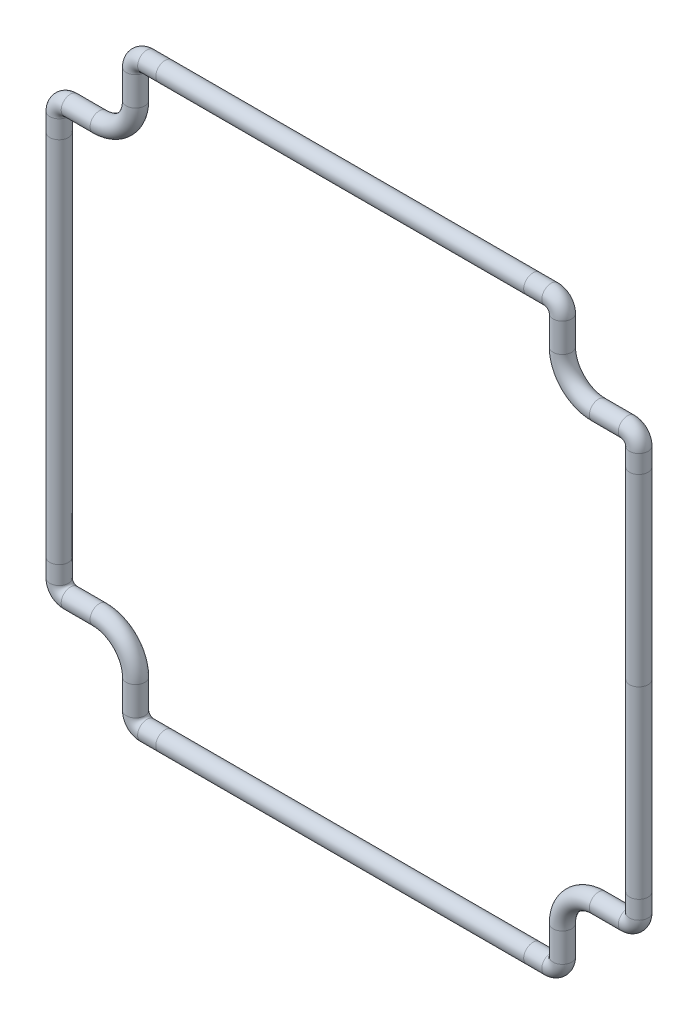
ISO-10303-21;
HEADER;
FILE_DESCRIPTION(('STEP AP214'),'2;1');
FILE_NAME('part.step','',(''),(''),'','','');
FILE_SCHEMA(('AUTOMOTIVE_DESIGN { 1 0 10303 214 1 1 1 1 }'));
ENDSEC;
DATA;
#1=APPLICATION_CONTEXT('core data for automotive mechanical design processes');
#2=APPLICATION_PROTOCOL_DEFINITION('international standard','automotive_design',2000,#1);
#3=PRODUCT_CONTEXT('',#1,'mechanical');
#4=PRODUCT('Part','Part','',(#3));
#5=PRODUCT_RELATED_PRODUCT_CATEGORY('part','',(#4));
#6=PRODUCT_DEFINITION_FORMATION('','',#4);
#7=PRODUCT_DEFINITION_CONTEXT('part definition',#1,'design');
#8=PRODUCT_DEFINITION('design','',#6,#7);
#9=PRODUCT_DEFINITION_SHAPE('','',#8);
#10=(LENGTH_UNIT() NAMED_UNIT(*) SI_UNIT(.MILLI.,.METRE.));
#11=(NAMED_UNIT(*) PLANE_ANGLE_UNIT() SI_UNIT($,.RADIAN.));
#12=(NAMED_UNIT(*) SI_UNIT($,.STERADIAN.) SOLID_ANGLE_UNIT());
#13=UNCERTAINTY_MEASURE_WITH_UNIT(LENGTH_MEASURE(1.E-05),#10,'distance_accuracy_value','');
#14=(GEOMETRIC_REPRESENTATION_CONTEXT(3) GLOBAL_UNCERTAINTY_ASSIGNED_CONTEXT((#13)) GLOBAL_UNIT_ASSIGNED_CONTEXT((#10,
#11,#12)) REPRESENTATION_CONTEXT('',''));
#15=CARTESIAN_POINT('',(0.,0.,0.));
#16=DIRECTION('',(0.,0.,1.));
#17=DIRECTION('',(1.,0.,0.));
#18=AXIS2_PLACEMENT_3D('',#15,#16,#17);
#19=CARTESIAN_POINT('',(20.32,0.,0.));
#20=DIRECTION('',(0.,-1.,0.));
#21=DIRECTION('',(0.,0.,-1.));
#22=AXIS2_PLACEMENT_3D('',#19,#20,#21);
#23=CYLINDRICAL_SURFACE('',#22,0.650000000000001);
#24=CARTESIAN_POINT('',(20.32,-12.8968500000001,0.));
#25=DIRECTION('',(0.,1.,0.));
#26=DIRECTION('',(0.,0.,1.));
#27=AXIS2_PLACEMENT_3D('',#24,#25,#26);
#28=CIRCLE('',#27,0.650000000000001);
#29=CARTESIAN_POINT('',(20.32,-12.8968500000001,0.650000000000001));
#30=VERTEX_POINT('',#29);
#31=EDGE_CURVE('E133',#30,#30,#28,.T.);
#32=ORIENTED_EDGE('',*,*,#31,.T.);
#33=EDGE_LOOP('',(#32));
#34=FACE_BOUND('',#33,.T.);
#35=CARTESIAN_POINT('',(20.32,0.,0.));
#36=DIRECTION('',(0.,1.,0.));
#37=DIRECTION('',(0.,0.,1.));
#38=AXIS2_PLACEMENT_3D('',#35,#36,#37);
#39=CIRCLE('',#38,0.650000000000001);
#40=CARTESIAN_POINT('',(20.32,0.,0.650000000000001));
#41=VERTEX_POINT('',#40);
#42=EDGE_CURVE('E136',#41,#41,#39,.T.);
#43=ORIENTED_EDGE('',*,*,#42,.F.);
#44=EDGE_LOOP('',(#43));
#45=FACE_BOUND('',#44,.T.);
#46=ADVANCED_FACE('F32',(#34,#45),#23,.T.);
#47=CARTESIAN_POINT('',(20.32,-12.896849999997,0.));
#48=DIRECTION('',(-1.52983487645165E-13,-1.,0.));
#49=DIRECTION('',(1.,-1.52983487645165E-13,0.));
#50=AXIS2_PLACEMENT_3D('',#47,#48,#49);
#51=CYLINDRICAL_SURFACE('',#50,0.650000000000001);
#52=CARTESIAN_POINT('',(20.3199999999998,-14.1668499999973,0.));
#53=DIRECTION('',(0.,1.,0.));
#54=DIRECTION('',(0.,0.,1.));
#55=AXIS2_PLACEMENT_3D('',#52,#53,#54);
#56=CIRCLE('',#55,0.650000000000001);
#57=CARTESIAN_POINT('',(20.9699999999998,-14.1668499999948,0.));
#58=VERTEX_POINT('',#57);
#59=EDGE_CURVE('E130',#58,#58,#56,.T.);
#60=ORIENTED_EDGE('',*,*,#59,.T.);
#61=EDGE_LOOP('',(#60));
#62=FACE_BOUND('',#61,.T.);
#63=ORIENTED_EDGE('',*,*,#31,.F.);
#64=EDGE_LOOP('',(#63));
#65=FACE_BOUND('',#64,.T.);
#66=ADVANCED_FACE('F143',(#62,#65),#51,.T.);
#67=CARTESIAN_POINT('',(19.5262499999998,-14.1668500000004,0.));
#68=DIRECTION('',(0.,0.,-1.));
#69=DIRECTION('',(-1.,0.,0.));
#70=AXIS2_PLACEMENT_3D('',#67,#68,#69);
#71=TOROIDAL_SURFACE('',#70,0.793749999999999,0.650000000000001);
#72=CARTESIAN_POINT('',(19.5262499999998,-14.9606000000004,0.));
#73=DIRECTION('',(1.,0.,0.));
#74=DIRECTION('',(0.,0.,1.));
#75=AXIS2_PLACEMENT_3D('',#72,#73,#74);
#76=CIRCLE('',#75,0.650000000000001);
#77=CARTESIAN_POINT('',(19.5262499999998,-15.6106000000004,0.));
#78=VERTEX_POINT('',#77);
#79=EDGE_CURVE('E127',#78,#78,#76,.T.);
#80=CARTESIAN_POINT('',(19.5262499999998,-14.1668500000004,0.));
#81=DIRECTION('',(0.,0.,-1.));
#82=DIRECTION('',(-1.,0.,0.));
#83=AXIS2_PLACEMENT_3D('',#80,#81,#82);
#84=CIRCLE('',#83,1.44375);
#85=EDGE_CURVE('',#58,#78,#84,.T.);
#86=ORIENTED_EDGE('',*,*,#59,.F.);
#87=ORIENTED_EDGE('',*,*,#79,.T.);
#88=ORIENTED_EDGE('',*,*,#85,.T.);
#89=ORIENTED_EDGE('',*,*,#85,.F.);
#90=EDGE_LOOP('',(#86,#88,#87,#89));
#91=FACE_BOUND('',#90,.T.);
#92=ADVANCED_FACE('F149',(#91),#71,.T.);
#93=CARTESIAN_POINT('',(19.5262499999998,-14.9606000000004,0.));
#94=DIRECTION('',(-1.,0.,0.));
#95=DIRECTION('',(0.,-1.,0.));
#96=AXIS2_PLACEMENT_3D('',#93,#94,#95);
#97=CYLINDRICAL_SURFACE('',#96,0.650000000000001);
#98=CARTESIAN_POINT('',(17.5005999999996,-14.9606000000004,0.));
#99=DIRECTION('',(1.,0.,0.));
#100=DIRECTION('',(0.,0.,1.));
#101=AXIS2_PLACEMENT_3D('',#98,#99,#100);
#102=CIRCLE('',#101,0.650000000000001);
#103=CARTESIAN_POINT('',(17.5005999999996,-14.3106000000004,0.));
#104=VERTEX_POINT('',#103);
#105=EDGE_CURVE('E124',#104,#104,#102,.T.);
#106=ORIENTED_EDGE('',*,*,#105,.T.);
#107=EDGE_LOOP('',(#106));
#108=FACE_BOUND('',#107,.T.);
#109=ORIENTED_EDGE('',*,*,#79,.F.);
#110=EDGE_LOOP('',(#109));
#111=FACE_BOUND('',#110,.T.);
#112=ADVANCED_FACE('F155',(#108,#111),#97,.T.);
#113=CARTESIAN_POINT('',(17.5005999999996,-17.5006000000004,0.));
#114=DIRECTION('',(0.,0.,1.));
#115=DIRECTION('',(1.,0.,0.));
#116=AXIS2_PLACEMENT_3D('',#113,#114,#115);
#117=TOROIDAL_SURFACE('',#116,2.54,0.650000000000001);
#118=CARTESIAN_POINT('',(14.9605999999996,-17.5006000000003,0.));
#119=DIRECTION('',(0.,1.,0.));
#120=DIRECTION('',(0.,0.,1.));
#121=AXIS2_PLACEMENT_3D('',#118,#119,#120);
#122=CIRCLE('',#121,0.650000000000001);
#123=CARTESIAN_POINT('',(14.3105999999996,-17.5006000000003,0.));
#124=VERTEX_POINT('',#123);
#125=EDGE_CURVE('E121',#124,#124,#122,.T.);
#126=CARTESIAN_POINT('',(17.5005999999996,-17.5006000000004,0.));
#127=DIRECTION('',(0.,0.,1.));
#128=DIRECTION('',(1.,0.,0.));
#129=AXIS2_PLACEMENT_3D('',#126,#127,#128);
#130=CIRCLE('',#129,3.19);
#131=EDGE_CURVE('',#104,#124,#130,.T.);
#132=ORIENTED_EDGE('',*,*,#105,.F.);
#133=ORIENTED_EDGE('',*,*,#125,.T.);
#134=ORIENTED_EDGE('',*,*,#131,.T.);
#135=ORIENTED_EDGE('',*,*,#131,.F.);
#136=EDGE_LOOP('',(#132,#134,#133,#135));
#137=FACE_BOUND('',#136,.T.);
#138=ADVANCED_FACE('F159',(#137),#117,.T.);
#139=CARTESIAN_POINT('',(14.9605999999996,-17.5006000000002,0.));
#140=DIRECTION('',(0.,-1.,0.));
#141=DIRECTION('',(1.,0.,0.));
#142=AXIS2_PLACEMENT_3D('',#139,#140,#141);
#143=CYLINDRICAL_SURFACE('',#142,0.650000000000001);
#144=CARTESIAN_POINT('',(14.9605999999996,-19.5262499999999,0.));
#145=DIRECTION('',(0.,1.,0.));
#146=DIRECTION('',(0.,0.,1.));
#147=AXIS2_PLACEMENT_3D('',#144,#145,#146);
#148=CIRCLE('',#147,0.650000000000001);
#149=CARTESIAN_POINT('',(15.6105999999996,-19.5262499999997,0.));
#150=VERTEX_POINT('',#149);
#151=EDGE_CURVE('E118',#150,#150,#148,.T.);
#152=ORIENTED_EDGE('',*,*,#151,.T.);
#153=EDGE_LOOP('',(#152));
#154=FACE_BOUND('',#153,.T.);
#155=ORIENTED_EDGE('',*,*,#125,.F.);
#156=EDGE_LOOP('',(#155));
#157=FACE_BOUND('',#156,.T.);
#158=ADVANCED_FACE('F163',(#154,#157),#143,.T.);
#159=CARTESIAN_POINT('',(14.1668499999996,-19.5262500000001,0.));
#160=DIRECTION('',(0.,0.,-1.));
#161=DIRECTION('',(-1.,0.,0.));
#162=AXIS2_PLACEMENT_3D('',#159,#160,#161);
#163=TOROIDAL_SURFACE('',#162,0.793749999999999,0.650000000000001);
#164=CARTESIAN_POINT('',(14.1668499999995,-20.3200000000001,0.));
#165=DIRECTION('',(1.,0.,0.));
#166=DIRECTION('',(0.,0.,1.));
#167=AXIS2_PLACEMENT_3D('',#164,#165,#166);
#168=CIRCLE('',#167,0.650000000000001);
#169=CARTESIAN_POINT('',(14.1668499999995,-20.9700000000001,0.));
#170=VERTEX_POINT('',#169);
#171=EDGE_CURVE('E115',#170,#170,#168,.T.);
#172=CARTESIAN_POINT('',(14.1668499999996,-19.5262500000001,0.));
#173=DIRECTION('',(0.,0.,-1.));
#174=DIRECTION('',(-1.,0.,0.));
#175=AXIS2_PLACEMENT_3D('',#172,#173,#174);
#176=CIRCLE('',#175,1.44375);
#177=EDGE_CURVE('',#150,#170,#176,.T.);
#178=ORIENTED_EDGE('',*,*,#151,.F.);
#179=ORIENTED_EDGE('',*,*,#171,.T.);
#180=ORIENTED_EDGE('',*,*,#177,.T.);
#181=ORIENTED_EDGE('',*,*,#177,.F.);
#182=EDGE_LOOP('',(#178,#180,#179,#181));
#183=FACE_BOUND('',#182,.T.);
#184=ADVANCED_FACE('F167',(#183),#163,.T.);
#185=CARTESIAN_POINT('',(14.1668499999995,-20.3200000000001,0.));
#186=DIRECTION('',(-1.,0.,0.));
#187=DIRECTION('',(0.,-1.,0.));
#188=AXIS2_PLACEMENT_3D('',#185,#186,#187);
#189=CYLINDRICAL_SURFACE('',#188,0.650000000000001);
#190=CARTESIAN_POINT('',(12.8968499999998,-20.32,0.));
#191=DIRECTION('',(1.,0.,0.));
#192=DIRECTION('',(0.,0.,1.));
#193=AXIS2_PLACEMENT_3D('',#190,#191,#192);
#194=CIRCLE('',#193,0.650000000000001);
#195=CARTESIAN_POINT('',(12.8968499999998,-20.32,0.650000000000001));
#196=VERTEX_POINT('',#195);
#197=EDGE_CURVE('E112',#196,#196,#194,.T.);
#198=ORIENTED_EDGE('',*,*,#197,.T.);
#199=EDGE_LOOP('',(#198));
#200=FACE_BOUND('',#199,.T.);
#201=ORIENTED_EDGE('',*,*,#171,.F.);
#202=EDGE_LOOP('',(#201));
#203=FACE_BOUND('',#202,.T.);
#204=ADVANCED_FACE('F171',(#200,#203),#189,.T.);
#205=CARTESIAN_POINT('',(12.8968499999998,-20.32,0.));
#206=DIRECTION('',(-1.,0.,0.));
#207=DIRECTION('',(0.,0.,1.));
#208=AXIS2_PLACEMENT_3D('',#205,#206,#207);
#209=CYLINDRICAL_SURFACE('',#208,0.650000000000001);
#210=CARTESIAN_POINT('',(-12.8968500000002,-20.32,0.));
#211=DIRECTION('',(1.,0.,0.));
#212=DIRECTION('',(0.,0.,1.));
#213=AXIS2_PLACEMENT_3D('',#210,#211,#212);
#214=CIRCLE('',#213,0.650000000000001);
#215=CARTESIAN_POINT('',(-12.8968500000002,-20.32,0.650000000000001));
#216=VERTEX_POINT('',#215);
#217=EDGE_CURVE('E109',#216,#216,#214,.T.);
#218=ORIENTED_EDGE('',*,*,#217,.T.);
#219=EDGE_LOOP('',(#218));
#220=FACE_BOUND('',#219,.T.);
#221=ORIENTED_EDGE('',*,*,#197,.F.);
#222=EDGE_LOOP('',(#221));
#223=FACE_BOUND('',#222,.T.);
#224=ADVANCED_FACE('F175',(#220,#223),#209,.T.);
#225=CARTESIAN_POINT('',(-12.8968500000002,-20.32,0.));
#226=DIRECTION('',(-1.,0.,0.));
#227=DIRECTION('',(0.,0.,1.));
#228=AXIS2_PLACEMENT_3D('',#225,#226,#227);
#229=CYLINDRICAL_SURFACE('',#228,0.650000000000001);
#230=CARTESIAN_POINT('',(-14.1668500000002,-20.32,0.));
#231=DIRECTION('',(1.,0.,0.));
#232=DIRECTION('',(0.,0.,1.));
#233=AXIS2_PLACEMENT_3D('',#230,#231,#232);
#234=CIRCLE('',#233,0.650000000000001);
#235=CARTESIAN_POINT('',(-14.1668500000002,-20.97,0.));
#236=VERTEX_POINT('',#235);
#237=EDGE_CURVE('E106',#236,#236,#234,.T.);
#238=ORIENTED_EDGE('',*,*,#237,.T.);
#239=EDGE_LOOP('',(#238));
#240=FACE_BOUND('',#239,.T.);
#241=ORIENTED_EDGE('',*,*,#217,.F.);
#242=EDGE_LOOP('',(#241));
#243=FACE_BOUND('',#242,.T.);
#244=ADVANCED_FACE('F179',(#240,#243),#229,.T.);
#245=CARTESIAN_POINT('',(-14.1668500000002,-19.52625,0.));
#246=DIRECTION('',(0.,0.,-1.));
#247=DIRECTION('',(-1.,0.,0.));
#248=AXIS2_PLACEMENT_3D('',#245,#246,#247);
#249=TOROIDAL_SURFACE('',#248,0.793749999999999,0.650000000000001);
#250=CARTESIAN_POINT('',(-14.9606000000002,-19.52625,0.));
#251=DIRECTION('',(0.,-1.,0.));
#252=DIRECTION('',(0.,0.,1.));
#253=AXIS2_PLACEMENT_3D('',#250,#251,#252);
#254=CIRCLE('',#253,0.650000000000001);
#255=CARTESIAN_POINT('',(-15.6106000000002,-19.52625,0.));
#256=VERTEX_POINT('',#255);
#257=EDGE_CURVE('E103',#256,#256,#254,.T.);
#258=CARTESIAN_POINT('',(-14.1668500000002,-19.52625,0.));
#259=DIRECTION('',(0.,0.,-1.));
#260=DIRECTION('',(-1.,0.,0.));
#261=AXIS2_PLACEMENT_3D('',#258,#259,#260);
#262=CIRCLE('',#261,1.44375);
#263=EDGE_CURVE('',#236,#256,#262,.T.);
#264=ORIENTED_EDGE('',*,*,#237,.F.);
#265=ORIENTED_EDGE('',*,*,#257,.T.);
#266=ORIENTED_EDGE('',*,*,#263,.T.);
#267=ORIENTED_EDGE('',*,*,#263,.F.);
#268=EDGE_LOOP('',(#264,#266,#265,#267));
#269=FACE_BOUND('',#268,.T.);
#270=ADVANCED_FACE('F183',(#269),#249,.T.);
#271=CARTESIAN_POINT('',(-14.9606000000002,-19.52625,0.));
#272=DIRECTION('',(0.,1.,0.));
#273=DIRECTION('',(-1.,0.,0.));
#274=AXIS2_PLACEMENT_3D('',#271,#272,#273);
#275=CYLINDRICAL_SURFACE('',#274,0.650000000000001);
#276=CARTESIAN_POINT('',(-14.9606000000002,-17.5005999999998,0.));
#277=DIRECTION('',(0.,-1.,0.));
#278=DIRECTION('',(0.,0.,1.));
#279=AXIS2_PLACEMENT_3D('',#276,#277,#278);
#280=CIRCLE('',#279,0.650000000000001);
#281=CARTESIAN_POINT('',(-14.3106000000002,-17.5005999999998,0.));
#282=VERTEX_POINT('',#281);
#283=EDGE_CURVE('E100',#282,#282,#280,.T.);
#284=ORIENTED_EDGE('',*,*,#283,.T.);
#285=EDGE_LOOP('',(#284));
#286=FACE_BOUND('',#285,.T.);
#287=ORIENTED_EDGE('',*,*,#257,.F.);
#288=EDGE_LOOP('',(#287));
#289=FACE_BOUND('',#288,.T.);
#290=ADVANCED_FACE('F187',(#286,#289),#275,.T.);
#291=CARTESIAN_POINT('',(-17.5006000000002,-17.5005999999998,0.));
#292=DIRECTION('',(0.,0.,1.));
#293=DIRECTION('',(1.,0.,0.));
#294=AXIS2_PLACEMENT_3D('',#291,#292,#293);
#295=TOROIDAL_SURFACE('',#294,2.54,0.650000000000001);
#296=CARTESIAN_POINT('',(-17.5006000000002,-14.9605999999998,0.));
#297=DIRECTION('',(1.,0.,0.));
#298=DIRECTION('',(0.,0.,1.));
#299=AXIS2_PLACEMENT_3D('',#296,#297,#298);
#300=CIRCLE('',#299,0.650000000000001);
#301=CARTESIAN_POINT('',(-17.5006000000002,-14.3105999999998,0.));
#302=VERTEX_POINT('',#301);
#303=EDGE_CURVE('E97',#302,#302,#300,.T.);
#304=CARTESIAN_POINT('',(-17.5006000000002,-17.5005999999998,0.));
#305=DIRECTION('',(0.,0.,1.));
#306=DIRECTION('',(1.,0.,0.));
#307=AXIS2_PLACEMENT_3D('',#304,#305,#306);
#308=CIRCLE('',#307,3.19);
#309=EDGE_CURVE('',#282,#302,#308,.T.);
#310=ORIENTED_EDGE('',*,*,#283,.F.);
#311=ORIENTED_EDGE('',*,*,#303,.T.);
#312=ORIENTED_EDGE('',*,*,#309,.T.);
#313=ORIENTED_EDGE('',*,*,#309,.F.);
#314=EDGE_LOOP('',(#310,#312,#311,#313));
#315=FACE_BOUND('',#314,.T.);
#316=ADVANCED_FACE('F191',(#315),#295,.T.);
#317=CARTESIAN_POINT('',(-17.5006000000002,-14.9605999999998,0.));
#318=DIRECTION('',(-1.,0.,0.));
#319=DIRECTION('',(0.,0.,1.));
#320=AXIS2_PLACEMENT_3D('',#317,#318,#319);
#321=CYLINDRICAL_SURFACE('',#320,0.650000000000001);
#322=CARTESIAN_POINT('',(-19.5262499999999,-14.9605999999998,0.));
#323=DIRECTION('',(1.,0.,0.));
#324=DIRECTION('',(0.,0.,1.));
#325=AXIS2_PLACEMENT_3D('',#322,#323,#324);
#326=CIRCLE('',#325,0.650000000000001);
#327=CARTESIAN_POINT('',(-19.5262499999999,-15.6105999999998,0.));
#328=VERTEX_POINT('',#327);
#329=EDGE_CURVE('E94',#328,#328,#326,.T.);
#330=ORIENTED_EDGE('',*,*,#329,.T.);
#331=EDGE_LOOP('',(#330));
#332=FACE_BOUND('',#331,.T.);
#333=ORIENTED_EDGE('',*,*,#303,.F.);
#334=EDGE_LOOP('',(#333));
#335=FACE_BOUND('',#334,.T.);
#336=ADVANCED_FACE('F195',(#332,#335),#321,.T.);
#337=CARTESIAN_POINT('',(-19.5262499999999,-14.1668499999998,0.));
#338=DIRECTION('',(0.,0.,-1.));
#339=DIRECTION('',(-1.,0.,0.));
#340=AXIS2_PLACEMENT_3D('',#337,#338,#339);
#341=TOROIDAL_SURFACE('',#340,0.793749999999999,0.650000000000001);
#342=CARTESIAN_POINT('',(-20.3199999999999,-14.1668499999998,0.));
#343=DIRECTION('',(0.,-1.,0.));
#344=DIRECTION('',(0.,0.,1.));
#345=AXIS2_PLACEMENT_3D('',#342,#343,#344);
#346=CIRCLE('',#345,0.650000000000001);
#347=CARTESIAN_POINT('',(-20.9699999999999,-14.1668499999997,0.));
#348=VERTEX_POINT('',#347);
#349=EDGE_CURVE('E91',#348,#348,#346,.T.);
#350=CARTESIAN_POINT('',(-19.5262499999999,-14.1668499999998,0.));
#351=DIRECTION('',(0.,0.,-1.));
#352=DIRECTION('',(-1.,0.,0.));
#353=AXIS2_PLACEMENT_3D('',#350,#351,#352);
#354=CIRCLE('',#353,1.44375);
#355=EDGE_CURVE('',#328,#348,#354,.T.);
#356=ORIENTED_EDGE('',*,*,#329,.F.);
#357=ORIENTED_EDGE('',*,*,#349,.T.);
#358=ORIENTED_EDGE('',*,*,#355,.T.);
#359=ORIENTED_EDGE('',*,*,#355,.F.);
#360=EDGE_LOOP('',(#356,#358,#357,#359));
#361=FACE_BOUND('',#360,.T.);
#362=ADVANCED_FACE('F199',(#361),#341,.T.);
#363=CARTESIAN_POINT('',(-20.3199999999999,-14.1668499999998,0.));
#364=DIRECTION('',(0.,1.,0.));
#365=DIRECTION('',(0.,0.,1.));
#366=AXIS2_PLACEMENT_3D('',#363,#364,#365);
#367=CYLINDRICAL_SURFACE('',#366,0.650000000000001);
#368=CARTESIAN_POINT('',(-20.3199999999999,-12.8968499999997,0.));
#369=DIRECTION('',(0.,-1.,0.));
#370=DIRECTION('',(0.,0.,1.));
#371=AXIS2_PLACEMENT_3D('',#368,#369,#370);
#372=CIRCLE('',#371,0.650000000000001);
#373=CARTESIAN_POINT('',(-20.3199999999999,-12.8968499999997,0.650000000000001));
#374=VERTEX_POINT('',#373);
#375=EDGE_CURVE('E88',#374,#374,#372,.T.);
#376=ORIENTED_EDGE('',*,*,#375,.T.);
#377=EDGE_LOOP('',(#376));
#378=FACE_BOUND('',#377,.T.);
#379=ORIENTED_EDGE('',*,*,#349,.F.);
#380=EDGE_LOOP('',(#379));
#381=FACE_BOUND('',#380,.T.);
#382=ADVANCED_FACE('F203',(#378,#381),#367,.T.);
#383=CARTESIAN_POINT('',(-20.3199999999999,-12.8968499999997,0.));
#384=DIRECTION('',(0.,1.,0.));
#385=DIRECTION('',(-1.,0.,0.));
#386=AXIS2_PLACEMENT_3D('',#383,#384,#385);
#387=CYLINDRICAL_SURFACE('',#386,0.650000000000001);
#388=CARTESIAN_POINT('',(-20.3199999999999,12.8968500000003,0.));
#389=DIRECTION('',(0.,-1.,0.));
#390=DIRECTION('',(0.,0.,1.));
#391=AXIS2_PLACEMENT_3D('',#388,#389,#390);
#392=CIRCLE('',#391,0.650000000000001);
#393=CARTESIAN_POINT('',(-20.3199999999999,12.8968500000003,0.650000000000001));
#394=VERTEX_POINT('',#393);
#395=EDGE_CURVE('E85',#394,#394,#392,.T.);
#396=ORIENTED_EDGE('',*,*,#395,.T.);
#397=EDGE_LOOP('',(#396));
#398=FACE_BOUND('',#397,.T.);
#399=ORIENTED_EDGE('',*,*,#375,.F.);
#400=EDGE_LOOP('',(#399));
#401=FACE_BOUND('',#400,.T.);
#402=ADVANCED_FACE('F207',(#398,#401),#387,.T.);
#403=CARTESIAN_POINT('',(-20.3199999999999,12.8968500000003,0.));
#404=DIRECTION('',(0.,1.,0.));
#405=DIRECTION('',(0.,0.,1.));
#406=AXIS2_PLACEMENT_3D('',#403,#404,#405);
#407=CYLINDRICAL_SURFACE('',#406,0.650000000000001);
#408=CARTESIAN_POINT('',(-20.3199999999999,14.1668500000003,0.));
#409=DIRECTION('',(0.,-1.,0.));
#410=DIRECTION('',(0.,0.,1.));
#411=AXIS2_PLACEMENT_3D('',#408,#409,#410);
#412=CIRCLE('',#411,0.650000000000001);
#413=CARTESIAN_POINT('',(-20.9699999999999,14.1668500000003,0.));
#414=VERTEX_POINT('',#413);
#415=EDGE_CURVE('E82',#414,#414,#412,.T.);
#416=ORIENTED_EDGE('',*,*,#415,.T.);
#417=EDGE_LOOP('',(#416));
#418=FACE_BOUND('',#417,.T.);
#419=ORIENTED_EDGE('',*,*,#395,.F.);
#420=EDGE_LOOP('',(#419));
#421=FACE_BOUND('',#420,.T.);
#422=ADVANCED_FACE('F211',(#418,#421),#407,.T.);
#423=CARTESIAN_POINT('',(-19.5262499999999,14.1668500000003,0.));
#424=DIRECTION('',(0.,0.,-1.));
#425=DIRECTION('',(-1.,0.,0.));
#426=AXIS2_PLACEMENT_3D('',#423,#424,#425);
#427=TOROIDAL_SURFACE('',#426,0.793750000000003,0.650000000000001);
#428=CARTESIAN_POINT('',(-19.5262499999999,14.9606000000003,0.));
#429=DIRECTION('',(-1.,0.,0.));
#430=DIRECTION('',(0.,0.,1.));
#431=AXIS2_PLACEMENT_3D('',#428,#429,#430);
#432=CIRCLE('',#431,0.650000000000001);
#433=CARTESIAN_POINT('',(-19.5262499999999,15.6106000000003,0.));
#434=VERTEX_POINT('',#433);
#435=EDGE_CURVE('E79',#434,#434,#432,.T.);
#436=CARTESIAN_POINT('',(-19.5262499999999,14.1668500000003,0.));
#437=DIRECTION('',(0.,0.,-1.));
#438=DIRECTION('',(-1.,0.,0.));
#439=AXIS2_PLACEMENT_3D('',#436,#437,#438);
#440=CIRCLE('',#439,1.44375);
#441=EDGE_CURVE('',#414,#434,#440,.T.);
#442=ORIENTED_EDGE('',*,*,#415,.F.);
#443=ORIENTED_EDGE('',*,*,#435,.T.);
#444=ORIENTED_EDGE('',*,*,#441,.T.);
#445=ORIENTED_EDGE('',*,*,#441,.F.);
#446=EDGE_LOOP('',(#442,#444,#443,#445));
#447=FACE_BOUND('',#446,.T.);
#448=ADVANCED_FACE('F215',(#447),#427,.T.);
#449=CARTESIAN_POINT('',(-19.5262499999999,14.9606000000003,0.));
#450=DIRECTION('',(1.,0.,0.));
#451=DIRECTION('',(0.,1.,0.));
#452=AXIS2_PLACEMENT_3D('',#449,#450,#451);
#453=CYLINDRICAL_SURFACE('',#452,0.650000000000001);
#454=CARTESIAN_POINT('',(-17.5005999999997,14.9606000000003,0.));
#455=DIRECTION('',(-1.,0.,0.));
#456=DIRECTION('',(0.,0.,1.));
#457=AXIS2_PLACEMENT_3D('',#454,#455,#456);
#458=CIRCLE('',#457,0.650000000000001);
#459=CARTESIAN_POINT('',(-17.5005999999997,14.3106000000003,0.));
#460=VERTEX_POINT('',#459);
#461=EDGE_CURVE('E76',#460,#460,#458,.T.);
#462=ORIENTED_EDGE('',*,*,#461,.T.);
#463=EDGE_LOOP('',(#462));
#464=FACE_BOUND('',#463,.T.);
#465=ORIENTED_EDGE('',*,*,#435,.F.);
#466=EDGE_LOOP('',(#465));
#467=FACE_BOUND('',#466,.T.);
#468=ADVANCED_FACE('F219',(#464,#467),#453,.T.);
#469=CARTESIAN_POINT('',(-17.5005999999997,17.5006000000003,0.));
#470=DIRECTION('',(0.,0.,1.));
#471=DIRECTION('',(1.,0.,0.));
#472=AXIS2_PLACEMENT_3D('',#469,#470,#471);
#473=TOROIDAL_SURFACE('',#472,2.54,0.650000000000001);
#474=CARTESIAN_POINT('',(-14.9605999999997,17.5006000000003,0.));
#475=DIRECTION('',(0.,-1.,0.));
#476=DIRECTION('',(0.,0.,1.));
#477=AXIS2_PLACEMENT_3D('',#474,#475,#476);
#478=CIRCLE('',#477,0.650000000000001);
#479=CARTESIAN_POINT('',(-14.3105999999997,17.5006000000003,0.));
#480=VERTEX_POINT('',#479);
#481=EDGE_CURVE('E73',#480,#480,#478,.T.);
#482=CARTESIAN_POINT('',(-17.5005999999997,17.5006000000003,0.));
#483=DIRECTION('',(0.,0.,1.));
#484=DIRECTION('',(1.,0.,0.));
#485=AXIS2_PLACEMENT_3D('',#482,#483,#484);
#486=CIRCLE('',#485,3.19);
#487=EDGE_CURVE('',#460,#480,#486,.T.);
#488=ORIENTED_EDGE('',*,*,#461,.F.);
#489=ORIENTED_EDGE('',*,*,#481,.T.);
#490=ORIENTED_EDGE('',*,*,#487,.T.);
#491=ORIENTED_EDGE('',*,*,#487,.F.);
#492=EDGE_LOOP('',(#488,#490,#489,#491));
#493=FACE_BOUND('',#492,.T.);
#494=ADVANCED_FACE('F223',(#493),#473,.T.);
#495=CARTESIAN_POINT('',(-14.9605999999997,17.5006000000003,0.));
#496=DIRECTION('',(0.,1.,0.));
#497=DIRECTION('',(-1.,0.,0.));
#498=AXIS2_PLACEMENT_3D('',#495,#496,#497);
#499=CYLINDRICAL_SURFACE('',#498,0.650000000000001);
#500=CARTESIAN_POINT('',(-14.9605999999997,19.52625,0.));
#501=DIRECTION('',(0.,-1.,0.));
#502=DIRECTION('',(0.,0.,1.));
#503=AXIS2_PLACEMENT_3D('',#500,#501,#502);
#504=CIRCLE('',#503,0.650000000000001);
#505=CARTESIAN_POINT('',(-15.6105999999997,19.52625,0.));
#506=VERTEX_POINT('',#505);
#507=EDGE_CURVE('E70',#506,#506,#504,.T.);
#508=ORIENTED_EDGE('',*,*,#507,.T.);
#509=EDGE_LOOP('',(#508));
#510=FACE_BOUND('',#509,.T.);
#511=ORIENTED_EDGE('',*,*,#481,.F.);
#512=EDGE_LOOP('',(#511));
#513=FACE_BOUND('',#512,.T.);
#514=ADVANCED_FACE('F227',(#510,#513),#499,.T.);
#515=CARTESIAN_POINT('',(-14.1668499999997,19.52625,0.));
#516=DIRECTION('',(0.,0.,-1.));
#517=DIRECTION('',(-1.,0.,0.));
#518=AXIS2_PLACEMENT_3D('',#515,#516,#517);
#519=TOROIDAL_SURFACE('',#518,0.793749999999999,0.650000000000001);
#520=CARTESIAN_POINT('',(-14.1668499999997,20.32,0.));
#521=DIRECTION('',(-1.,0.,0.));
#522=DIRECTION('',(0.,0.,1.));
#523=AXIS2_PLACEMENT_3D('',#520,#521,#522);
#524=CIRCLE('',#523,0.650000000000001);
#525=CARTESIAN_POINT('',(-14.1668499999997,20.97,0.));
#526=VERTEX_POINT('',#525);
#527=EDGE_CURVE('E67',#526,#526,#524,.T.);
#528=CARTESIAN_POINT('',(-14.1668499999997,19.52625,0.));
#529=DIRECTION('',(0.,0.,-1.));
#530=DIRECTION('',(-1.,0.,0.));
#531=AXIS2_PLACEMENT_3D('',#528,#529,#530);
#532=CIRCLE('',#531,1.44375);
#533=EDGE_CURVE('',#506,#526,#532,.T.);
#534=ORIENTED_EDGE('',*,*,#507,.F.);
#535=ORIENTED_EDGE('',*,*,#527,.T.);
#536=ORIENTED_EDGE('',*,*,#533,.T.);
#537=ORIENTED_EDGE('',*,*,#533,.F.);
#538=EDGE_LOOP('',(#534,#536,#535,#537));
#539=FACE_BOUND('',#538,.T.);
#540=ADVANCED_FACE('F231',(#539),#519,.T.);
#541=CARTESIAN_POINT('',(-14.1668499999997,20.32,0.));
#542=DIRECTION('',(1.,0.,0.));
#543=DIRECTION('',(0.,1.,0.));
#544=AXIS2_PLACEMENT_3D('',#541,#542,#543);
#545=CYLINDRICAL_SURFACE('',#544,0.650000000000001);
#546=CARTESIAN_POINT('',(-12.8968499999997,20.3199999999999,0.));
#547=DIRECTION('',(-1.,0.,0.));
#548=DIRECTION('',(0.,0.,1.));
#549=AXIS2_PLACEMENT_3D('',#546,#547,#548);
#550=CIRCLE('',#549,0.650000000000001);
#551=CARTESIAN_POINT('',(-12.8968499999997,20.3199999999999,0.650000000000001));
#552=VERTEX_POINT('',#551);
#553=EDGE_CURVE('E64',#552,#552,#550,.T.);
#554=ORIENTED_EDGE('',*,*,#553,.T.);
#555=EDGE_LOOP('',(#554));
#556=FACE_BOUND('',#555,.T.);
#557=ORIENTED_EDGE('',*,*,#527,.F.);
#558=EDGE_LOOP('',(#557));
#559=FACE_BOUND('',#558,.T.);
#560=ADVANCED_FACE('F235',(#556,#559),#545,.T.);
#561=CARTESIAN_POINT('',(-12.8968499999997,20.3199999999999,0.));
#562=DIRECTION('',(1.,0.,0.));
#563=DIRECTION('',(0.,0.,-1.));
#564=AXIS2_PLACEMENT_3D('',#561,#562,#563);
#565=CYLINDRICAL_SURFACE('',#564,0.650000000000001);
#566=CARTESIAN_POINT('',(12.8968500000004,20.3199999999999,0.));
#567=DIRECTION('',(-1.,0.,0.));
#568=DIRECTION('',(0.,0.,1.));
#569=AXIS2_PLACEMENT_3D('',#566,#567,#568);
#570=CIRCLE('',#569,0.650000000000001);
#571=CARTESIAN_POINT('',(12.8968500000004,20.3199999999999,0.650000000000001));
#572=VERTEX_POINT('',#571);
#573=EDGE_CURVE('E61',#572,#572,#570,.T.);
#574=ORIENTED_EDGE('',*,*,#573,.T.);
#575=EDGE_LOOP('',(#574));
#576=FACE_BOUND('',#575,.T.);
#577=ORIENTED_EDGE('',*,*,#553,.F.);
#578=EDGE_LOOP('',(#577));
#579=FACE_BOUND('',#578,.T.);
#580=ADVANCED_FACE('F239',(#576,#579),#565,.T.);
#581=CARTESIAN_POINT('',(12.8968500000004,20.3199999999999,0.));
#582=DIRECTION('',(1.,0.,0.));
#583=DIRECTION('',(0.,1.,0.));
#584=AXIS2_PLACEMENT_3D('',#581,#582,#583);
#585=CYLINDRICAL_SURFACE('',#584,0.650000000000001);
#586=CARTESIAN_POINT('',(14.1668500000003,20.3199999999999,0.));
#587=DIRECTION('',(-1.,0.,0.));
#588=DIRECTION('',(0.,0.,1.));
#589=AXIS2_PLACEMENT_3D('',#586,#587,#588);
#590=CIRCLE('',#589,0.650000000000001);
#591=CARTESIAN_POINT('',(14.1668500000003,20.9699999999999,0.));
#592=VERTEX_POINT('',#591);
#593=EDGE_CURVE('E58',#592,#592,#590,.T.);
#594=ORIENTED_EDGE('',*,*,#593,.T.);
#595=EDGE_LOOP('',(#594));
#596=FACE_BOUND('',#595,.T.);
#597=ORIENTED_EDGE('',*,*,#573,.F.);
#598=EDGE_LOOP('',(#597));
#599=FACE_BOUND('',#598,.T.);
#600=ADVANCED_FACE('F243',(#596,#599),#585,.T.);
#601=CARTESIAN_POINT('',(14.1668500000003,19.5262499999999,0.));
#602=DIRECTION('',(0.,0.,-1.));
#603=DIRECTION('',(-1.,0.,0.));
#604=AXIS2_PLACEMENT_3D('',#601,#602,#603);
#605=TOROIDAL_SURFACE('',#604,0.793749999999999,0.650000000000001);
#606=CARTESIAN_POINT('',(14.9606000000003,19.5262499999999,0.));
#607=DIRECTION('',(0.,1.,0.));
#608=DIRECTION('',(0.,0.,1.));
#609=AXIS2_PLACEMENT_3D('',#606,#607,#608);
#610=CIRCLE('',#609,0.650000000000001);
#611=CARTESIAN_POINT('',(15.6106000000003,19.5262499999999,0.));
#612=VERTEX_POINT('',#611);
#613=EDGE_CURVE('E55',#612,#612,#610,.T.);
#614=CARTESIAN_POINT('',(14.1668500000003,19.5262499999999,0.));
#615=DIRECTION('',(0.,0.,-1.));
#616=DIRECTION('',(-1.,0.,0.));
#617=AXIS2_PLACEMENT_3D('',#614,#615,#616);
#618=CIRCLE('',#617,1.44375);
#619=EDGE_CURVE('',#592,#612,#618,.T.);
#620=ORIENTED_EDGE('',*,*,#593,.F.);
#621=ORIENTED_EDGE('',*,*,#613,.T.);
#622=ORIENTED_EDGE('',*,*,#619,.T.);
#623=ORIENTED_EDGE('',*,*,#619,.F.);
#624=EDGE_LOOP('',(#620,#622,#621,#623));
#625=FACE_BOUND('',#624,.T.);
#626=ADVANCED_FACE('F247',(#625),#605,.T.);
#627=CARTESIAN_POINT('',(14.9606000000003,19.52625,0.));
#628=DIRECTION('',(0.,-1.,0.));
#629=DIRECTION('',(1.,0.,0.));
#630=AXIS2_PLACEMENT_3D('',#627,#628,#629);
#631=CYLINDRICAL_SURFACE('',#630,0.650000000000001);
#632=CARTESIAN_POINT('',(14.9606000000003,17.5005999999998,0.));
#633=DIRECTION('',(0.,1.,0.));
#634=DIRECTION('',(0.,0.,1.));
#635=AXIS2_PLACEMENT_3D('',#632,#633,#634);
#636=CIRCLE('',#635,0.650000000000001);
#637=CARTESIAN_POINT('',(14.3106000000003,17.5005999999999,0.));
#638=VERTEX_POINT('',#637);
#639=EDGE_CURVE('E52',#638,#638,#636,.T.);
#640=ORIENTED_EDGE('',*,*,#639,.T.);
#641=EDGE_LOOP('',(#640));
#642=FACE_BOUND('',#641,.T.);
#643=ORIENTED_EDGE('',*,*,#613,.F.);
#644=EDGE_LOOP('',(#643));
#645=FACE_BOUND('',#644,.T.);
#646=ADVANCED_FACE('F251',(#642,#645),#631,.T.);
#647=CARTESIAN_POINT('',(17.5006000000003,17.5005999999996,0.));
#648=DIRECTION('',(0.,0.,1.));
#649=DIRECTION('',(1.,0.,0.));
#650=AXIS2_PLACEMENT_3D('',#647,#648,#649);
#651=TOROIDAL_SURFACE('',#650,2.54,0.650000000000001);
#652=CARTESIAN_POINT('',(17.5006000000003,14.9605999999996,0.));
#653=DIRECTION('',(-1.,0.,0.));
#654=DIRECTION('',(0.,0.,1.));
#655=AXIS2_PLACEMENT_3D('',#652,#653,#654);
#656=CIRCLE('',#655,0.650000000000001);
#657=CARTESIAN_POINT('',(17.5006000000003,14.3105999999996,0.));
#658=VERTEX_POINT('',#657);
#659=EDGE_CURVE('E47',#658,#658,#656,.T.);
#660=CARTESIAN_POINT('',(17.5006000000003,17.5005999999996,0.));
#661=DIRECTION('',(0.,0.,1.));
#662=DIRECTION('',(1.,0.,0.));
#663=AXIS2_PLACEMENT_3D('',#660,#661,#662);
#664=CIRCLE('',#663,3.19);
#665=EDGE_CURVE('',#638,#658,#664,.T.);
#666=ORIENTED_EDGE('',*,*,#639,.F.);
#667=ORIENTED_EDGE('',*,*,#659,.T.);
#668=ORIENTED_EDGE('',*,*,#665,.T.);
#669=ORIENTED_EDGE('',*,*,#665,.F.);
#670=EDGE_LOOP('',(#666,#668,#667,#669));
#671=FACE_BOUND('',#670,.T.);
#672=ADVANCED_FACE('F255',(#671),#651,.T.);
#673=CARTESIAN_POINT('',(17.5006000000003,14.9605999999996,0.));
#674=DIRECTION('',(1.,0.,0.));
#675=DIRECTION('',(0.,1.,0.));
#676=AXIS2_PLACEMENT_3D('',#673,#674,#675);
#677=CYLINDRICAL_SURFACE('',#676,0.650000000000001);
#678=CARTESIAN_POINT('',(19.52625,14.9605999999996,0.));
#679=DIRECTION('',(-1.,0.,0.));
#680=DIRECTION('',(0.,0.,1.));
#681=AXIS2_PLACEMENT_3D('',#678,#679,#680);
#682=CIRCLE('',#681,0.650000000000001);
#683=CARTESIAN_POINT('',(19.52625,15.6105999999996,0.));
#684=VERTEX_POINT('',#683);
#685=EDGE_CURVE('E43',#684,#684,#682,.T.);
#686=ORIENTED_EDGE('',*,*,#685,.T.);
#687=EDGE_LOOP('',(#686));
#688=FACE_BOUND('',#687,.T.);
#689=ORIENTED_EDGE('',*,*,#659,.F.);
#690=EDGE_LOOP('',(#689));
#691=FACE_BOUND('',#690,.T.);
#692=ADVANCED_FACE('F259',(#688,#691),#677,.T.);
#693=CARTESIAN_POINT('',(19.52625,14.1668499999996,0.));
#694=DIRECTION('',(0.,0.,-1.));
#695=DIRECTION('',(-1.,0.,0.));
#696=AXIS2_PLACEMENT_3D('',#693,#694,#695);
#697=TOROIDAL_SURFACE('',#696,0.793749999999999,0.650000000000001);
#698=CARTESIAN_POINT('',(20.32,14.1668499999996,0.));
#699=DIRECTION('',(0.,1.,0.));
#700=DIRECTION('',(0.,0.,1.));
#701=AXIS2_PLACEMENT_3D('',#698,#699,#700);
#702=CIRCLE('',#701,0.650000000000001);
#703=CARTESIAN_POINT('',(20.97,14.1668499999996,0.));
#704=VERTEX_POINT('',#703);
#705=EDGE_CURVE('E39',#704,#704,#702,.T.);
#706=CARTESIAN_POINT('',(19.52625,14.1668499999996,0.));
#707=DIRECTION('',(0.,0.,-1.));
#708=DIRECTION('',(-1.,0.,0.));
#709=AXIS2_PLACEMENT_3D('',#706,#707,#708);
#710=CIRCLE('',#709,1.44375);
#711=EDGE_CURVE('',#684,#704,#710,.T.);
#712=ORIENTED_EDGE('',*,*,#685,.F.);
#713=ORIENTED_EDGE('',*,*,#705,.T.);
#714=ORIENTED_EDGE('',*,*,#711,.T.);
#715=ORIENTED_EDGE('',*,*,#711,.F.);
#716=EDGE_LOOP('',(#712,#714,#713,#715));
#717=FACE_BOUND('',#716,.T.);
#718=ADVANCED_FACE('F263',(#717),#697,.T.);
#719=CARTESIAN_POINT('',(20.32,14.1668499999998,0.));
#720=DIRECTION('',(0.,-1.,0.));
#721=DIRECTION('',(1.,0.,0.));
#722=AXIS2_PLACEMENT_3D('',#719,#720,#721);
#723=CYLINDRICAL_SURFACE('',#722,0.650000000000001);
#724=CARTESIAN_POINT('',(20.32,12.8968499999998,0.));
#725=DIRECTION('',(0.,1.,0.));
#726=DIRECTION('',(0.,0.,1.));
#727=AXIS2_PLACEMENT_3D('',#724,#725,#726);
#728=CIRCLE('',#727,0.650000000000001);
#729=CARTESIAN_POINT('',(20.32,12.8968499999998,0.650000000000001));
#730=VERTEX_POINT('',#729);
#731=EDGE_CURVE('E10',#730,#730,#728,.T.);
#732=ORIENTED_EDGE('',*,*,#731,.T.);
#733=EDGE_LOOP('',(#732));
#734=FACE_BOUND('',#733,.T.);
#735=ORIENTED_EDGE('',*,*,#705,.F.);
#736=EDGE_LOOP('',(#735));
#737=FACE_BOUND('',#736,.T.);
#738=ADVANCED_FACE('F266',(#734,#737),#723,.T.);
#739=CARTESIAN_POINT('',(20.32,12.8968499999996,0.));
#740=DIRECTION('',(0.,-1.,0.));
#741=DIRECTION('',(0.,0.,-1.));
#742=AXIS2_PLACEMENT_3D('',#739,#740,#741);
#743=CYLINDRICAL_SURFACE('',#742,0.650000000000001);
#744=ORIENTED_EDGE('',*,*,#42,.T.);
#745=EDGE_LOOP('',(#744));
#746=FACE_BOUND('',#745,.T.);
#747=ORIENTED_EDGE('',*,*,#731,.F.);
#748=EDGE_LOOP('',(#747));
#749=FACE_BOUND('',#748,.T.);
#750=ADVANCED_FACE('F34',(#746,#749),#743,.T.);
#751=CLOSED_SHELL('',(#46,#66,#92,#112,#138,#158,#184,#204,#224,#244,#270,#290,#316,#336,#362,
#382,#402,#422,#448,#468,#494,#514,#540,#560,#580,#600,#626,#646,#672,#692,#718,#738,#750));
#752=MANIFOLD_SOLID_BREP('B2',#751);
#753=ADVANCED_BREP_SHAPE_REPRESENTATION('',(#18,#752),#14);
#754=SHAPE_DEFINITION_REPRESENTATION(#9,#753);
ENDSEC;
END-ISO-10303-21;
